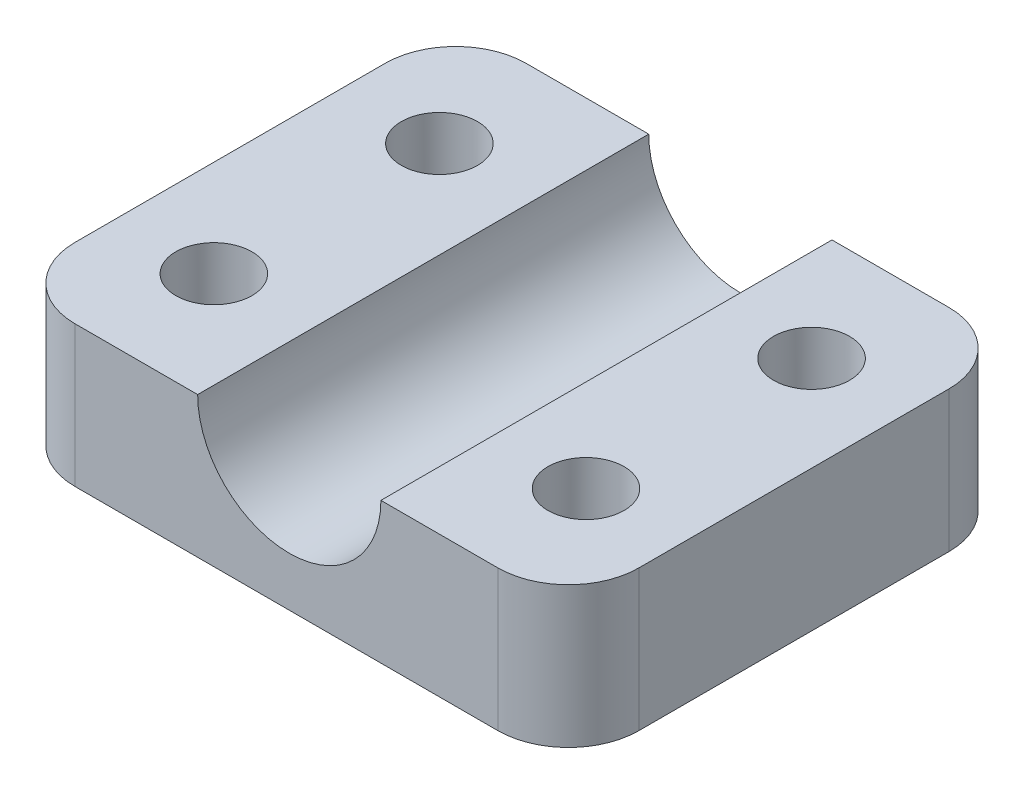
ISO-10303-21;
HEADER;
FILE_DESCRIPTION(('STEP AP214'),'2;1');
FILE_NAME('part.step','',(''),(''),'','','');
FILE_SCHEMA(('AUTOMOTIVE_DESIGN { 1 0 10303 214 1 1 1 1 }'));
ENDSEC;
DATA;
#1=APPLICATION_CONTEXT('core data for automotive mechanical design processes');
#2=APPLICATION_PROTOCOL_DEFINITION('international standard','automotive_design',2000,#1);
#3=PRODUCT_CONTEXT('',#1,'mechanical');
#4=PRODUCT('Part','Part','',(#3));
#5=PRODUCT_RELATED_PRODUCT_CATEGORY('part','',(#4));
#6=PRODUCT_DEFINITION_FORMATION('','',#4);
#7=PRODUCT_DEFINITION_CONTEXT('part definition',#1,'design');
#8=PRODUCT_DEFINITION('design','',#6,#7);
#9=PRODUCT_DEFINITION_SHAPE('','',#8);
#10=(LENGTH_UNIT() NAMED_UNIT(*) SI_UNIT(.MILLI.,.METRE.));
#11=(NAMED_UNIT(*) PLANE_ANGLE_UNIT() SI_UNIT($,.RADIAN.));
#12=(NAMED_UNIT(*) SI_UNIT($,.STERADIAN.) SOLID_ANGLE_UNIT());
#13=UNCERTAINTY_MEASURE_WITH_UNIT(LENGTH_MEASURE(1.E-05),#10,'distance_accuracy_value','');
#14=(GEOMETRIC_REPRESENTATION_CONTEXT(3) GLOBAL_UNCERTAINTY_ASSIGNED_CONTEXT((#13)) GLOBAL_UNIT_ASSIGNED_CONTEXT((#10,
#11,#12)) REPRESENTATION_CONTEXT('',''));
#15=CARTESIAN_POINT('',(0.,0.,0.));
#16=DIRECTION('',(0.,0.,1.));
#17=DIRECTION('',(1.,0.,0.));
#18=AXIS2_PLACEMENT_3D('',#15,#16,#17);
#19=CARTESIAN_POINT('',(0.,12.7,0.));
#20=DIRECTION('',(0.,-1.,0.));
#21=DIRECTION('',(0.,0.,-1.));
#22=AXIS2_PLACEMENT_3D('',#19,#20,#21);
#23=PLANE('',#22);
#24=CARTESIAN_POINT('',(42.2274999999999,12.7,-30.48));
#25=DIRECTION('',(0.,-1.,0.));
#26=DIRECTION('',(0.,0.,-1.));
#27=AXIS2_PLACEMENT_3D('',#24,#25,#26);
#28=CIRCLE('',#27,3.429);
#29=CARTESIAN_POINT('',(42.2274999999999,12.7,-33.909));
#30=VERTEX_POINT('',#29);
#31=EDGE_CURVE('E139',#30,#30,#28,.T.);
#32=ORIENTED_EDGE('',*,*,#31,.T.);
#33=EDGE_LOOP('',(#32));
#34=FACE_BOUND('',#33,.T.);
#35=CARTESIAN_POINT('',(42.2275,12.7,-10.16));
#36=DIRECTION('',(0.,-1.,0.));
#37=DIRECTION('',(0.,0.,-1.));
#38=AXIS2_PLACEMENT_3D('',#35,#36,#37);
#39=CIRCLE('',#38,3.429);
#40=CARTESIAN_POINT('',(42.2275,12.7,-13.589));
#41=VERTEX_POINT('',#40);
#42=EDGE_CURVE('E248',#41,#41,#39,.T.);
#43=ORIENTED_EDGE('',*,*,#42,.T.);
#44=EDGE_LOOP('',(#43));
#45=FACE_BOUND('',#44,.T.);
#46=DIRECTION('',(1.,0.,0.));
#47=VECTOR('',#46,1.);
#48=CARTESIAN_POINT('',(0.,12.7,0.));
#49=LINE('',#48,#47);
#50=CARTESIAN_POINT('',(33.909,12.7,0.));
#51=VERTEX_POINT('',#50);
#52=CARTESIAN_POINT('',(44.45,12.7,0.));
#53=VERTEX_POINT('',#52);
#54=EDGE_CURVE('E146',#51,#53,#49,.T.);
#55=ORIENTED_EDGE('',*,*,#54,.T.);
#56=CARTESIAN_POINT('',(44.45,12.7,-6.35));
#57=DIRECTION('',(0.,-1.,0.));
#58=DIRECTION('',(0.,0.,-1.));
#59=AXIS2_PLACEMENT_3D('',#56,#57,#58);
#60=CIRCLE('',#59,6.35);
#61=CARTESIAN_POINT('',(50.8,12.7,-6.35));
#62=VERTEX_POINT('',#61);
#63=EDGE_CURVE('E180',#53,#62,#60,.F.);
#64=ORIENTED_EDGE('',*,*,#63,.T.);
#65=DIRECTION('',(0.,0.,-1.));
#66=VECTOR('',#65,1.);
#67=CARTESIAN_POINT('',(50.8,12.7,0.));
#68=LINE('',#67,#66);
#69=CARTESIAN_POINT('',(50.8,12.7,-34.29));
#70=VERTEX_POINT('',#69);
#71=EDGE_CURVE('E150',#62,#70,#68,.T.);
#72=ORIENTED_EDGE('',*,*,#71,.T.);
#73=CARTESIAN_POINT('',(44.45,12.7,-34.29));
#74=DIRECTION('',(0.,-1.,0.));
#75=DIRECTION('',(0.,0.,-1.));
#76=AXIS2_PLACEMENT_3D('',#73,#74,#75);
#77=CIRCLE('',#76,6.35);
#78=CARTESIAN_POINT('',(44.45,12.7,-40.64));
#79=VERTEX_POINT('',#78);
#80=EDGE_CURVE('E119',#70,#79,#77,.F.);
#81=ORIENTED_EDGE('',*,*,#80,.T.);
#82=DIRECTION('',(-1.,0.,0.));
#83=VECTOR('',#82,1.);
#84=CARTESIAN_POINT('',(0.,12.7,-40.64));
#85=LINE('',#84,#83);
#86=CARTESIAN_POINT('',(33.909,12.7,-40.64));
#87=VERTEX_POINT('',#86);
#88=EDGE_CURVE('E112',#79,#87,#85,.T.);
#89=ORIENTED_EDGE('',*,*,#88,.T.);
#90=DIRECTION('',(0.,0.,1.));
#91=VECTOR('',#90,1.);
#92=CARTESIAN_POINT('',(33.909,12.7,-40.64));
#93=LINE('',#92,#91);
#94=EDGE_CURVE('E115',#87,#51,#93,.T.);
#95=ORIENTED_EDGE('',*,*,#94,.T.);
#96=EDGE_LOOP('',(#55,#64,#72,#81,#89,#95));
#97=FACE_BOUND('',#96,.T.);
#98=ADVANCED_FACE('F33',(#34,#45,#97),#23,.F.);
#99=CARTESIAN_POINT('',(0.,12.7,0.));
#100=DIRECTION('',(1.,0.,0.));
#101=DIRECTION('',(0.,0.,-1.));
#102=AXIS2_PLACEMENT_3D('',#99,#100,#101);
#103=PLANE('',#102);
#104=DIRECTION('',(0.,0.,1.));
#105=VECTOR('',#104,1.);
#106=CARTESIAN_POINT('',(0.,0.,0.));
#107=LINE('',#106,#105);
#108=CARTESIAN_POINT('',(0.,0.,-34.29));
#109=VERTEX_POINT('',#108);
#110=CARTESIAN_POINT('',(0.,0.,-6.35));
#111=VERTEX_POINT('',#110);
#112=EDGE_CURVE('E152',#109,#111,#107,.T.);
#113=ORIENTED_EDGE('',*,*,#112,.T.);
#114=DIRECTION('',(0.,-1.,0.));
#115=VECTOR('',#114,1.);
#116=CARTESIAN_POINT('',(0.,12.7,-6.35));
#117=LINE('',#116,#115);
#118=CARTESIAN_POINT('',(0.,12.7,-6.35));
#119=VERTEX_POINT('',#118);
#120=EDGE_CURVE('E54',#111,#119,#117,.F.);
#121=ORIENTED_EDGE('',*,*,#120,.T.);
#122=DIRECTION('',(0.,0.,1.));
#123=VECTOR('',#122,1.);
#124=CARTESIAN_POINT('',(0.,12.7,0.));
#125=LINE('',#124,#123);
#126=CARTESIAN_POINT('',(0.,12.7,-34.29));
#127=VERTEX_POINT('',#126);
#128=EDGE_CURVE('E144',#127,#119,#125,.T.);
#129=ORIENTED_EDGE('',*,*,#128,.F.);
#130=DIRECTION('',(0.,-1.,0.));
#131=VECTOR('',#130,1.);
#132=CARTESIAN_POINT('',(0.,12.7,-34.29));
#133=LINE('',#132,#131);
#134=EDGE_CURVE('E182',#127,#109,#133,.T.);
#135=ORIENTED_EDGE('',*,*,#134,.T.);
#136=EDGE_LOOP('',(#113,#121,#129,#135));
#137=FACE_BOUND('',#136,.T.);
#138=ADVANCED_FACE('F199',(#137),#103,.F.);
#139=CARTESIAN_POINT('',(0.,12.7,0.));
#140=DIRECTION('',(0.,0.,-1.));
#141=DIRECTION('',(-1.,0.,0.));
#142=AXIS2_PLACEMENT_3D('',#139,#140,#141);
#143=PLANE('',#142);
#144=DIRECTION('',(1.,0.,0.));
#145=VECTOR('',#144,1.);
#146=CARTESIAN_POINT('',(0.,0.,0.));
#147=LINE('',#146,#145);
#148=CARTESIAN_POINT('',(6.35,0.,0.));
#149=VERTEX_POINT('',#148);
#150=CARTESIAN_POINT('',(44.45,0.,0.));
#151=VERTEX_POINT('',#150);
#152=EDGE_CURVE('E154',#149,#151,#147,.T.);
#153=ORIENTED_EDGE('',*,*,#152,.T.);
#154=DIRECTION('',(0.,-1.,0.));
#155=VECTOR('',#154,1.);
#156=CARTESIAN_POINT('',(44.45,12.7,0.));
#157=LINE('',#156,#155);
#158=EDGE_CURVE('E177',#151,#53,#157,.F.);
#159=ORIENTED_EDGE('',*,*,#158,.T.);
#160=ORIENTED_EDGE('',*,*,#54,.F.);
#161=CARTESIAN_POINT('',(25.654,12.7,0.));
#162=DIRECTION('',(0.,0.,1.));
#163=DIRECTION('',(1.,0.,0.));
#164=AXIS2_PLACEMENT_3D('',#161,#162,#163);
#165=CIRCLE('',#164,8.255);
#166=CARTESIAN_POINT('',(17.399,12.7,0.));
#167=VERTEX_POINT('',#166);
#168=EDGE_CURVE('E132',#167,#51,#165,.T.);
#169=ORIENTED_EDGE('',*,*,#168,.F.);
#170=CARTESIAN_POINT('',(6.35,12.7,0.));
#171=VERTEX_POINT('',#170);
#172=EDGE_CURVE('E148',#171,#167,#49,.T.);
#173=ORIENTED_EDGE('',*,*,#172,.F.);
#174=DIRECTION('',(0.,-1.,0.));
#175=VECTOR('',#174,1.);
#176=CARTESIAN_POINT('',(6.35,12.7,0.));
#177=LINE('',#176,#175);
#178=EDGE_CURVE('E174',#171,#149,#177,.T.);
#179=ORIENTED_EDGE('',*,*,#178,.T.);
#180=EDGE_LOOP('',(#153,#159,#160,#169,#173,#179));
#181=FACE_BOUND('',#180,.T.);
#182=ADVANCED_FACE('F209',(#181),#143,.F.);
#183=CARTESIAN_POINT('',(50.8,12.7,0.));
#184=DIRECTION('',(-1.,0.,0.));
#185=DIRECTION('',(0.,0.,1.));
#186=AXIS2_PLACEMENT_3D('',#183,#184,#185);
#187=PLANE('',#186);
#188=ORIENTED_EDGE('',*,*,#71,.F.);
#189=DIRECTION('',(0.,-1.,0.));
#190=VECTOR('',#189,1.);
#191=CARTESIAN_POINT('',(50.8,12.7,-6.35));
#192=LINE('',#191,#190);
#193=CARTESIAN_POINT('',(50.8,0.,-6.35));
#194=VERTEX_POINT('',#193);
#195=EDGE_CURVE('E163',#62,#194,#192,.T.);
#196=ORIENTED_EDGE('',*,*,#195,.T.);
#197=DIRECTION('',(0.,0.,-1.));
#198=VECTOR('',#197,1.);
#199=CARTESIAN_POINT('',(50.8,0.,0.));
#200=LINE('',#199,#198);
#201=CARTESIAN_POINT('',(50.8,0.,-34.29));
#202=VERTEX_POINT('',#201);
#203=EDGE_CURVE('E157',#194,#202,#200,.T.);
#204=ORIENTED_EDGE('',*,*,#203,.T.);
#205=DIRECTION('',(0.,-1.,0.));
#206=VECTOR('',#205,1.);
#207=CARTESIAN_POINT('',(50.8,12.7,-34.29));
#208=LINE('',#207,#206);
#209=EDGE_CURVE('E123',#202,#70,#208,.F.);
#210=ORIENTED_EDGE('',*,*,#209,.T.);
#211=EDGE_LOOP('',(#188,#196,#204,#210));
#212=FACE_BOUND('',#211,.T.);
#213=ADVANCED_FACE('F217',(#212),#187,.F.);
#214=CARTESIAN_POINT('',(0.,12.7,-40.64));
#215=DIRECTION('',(0.,0.,1.));
#216=DIRECTION('',(1.,0.,0.));
#217=AXIS2_PLACEMENT_3D('',#214,#215,#216);
#218=PLANE('',#217);
#219=DIRECTION('',(-1.,0.,0.));
#220=VECTOR('',#219,1.);
#221=CARTESIAN_POINT('',(0.,0.,-40.64));
#222=LINE('',#221,#220);
#223=CARTESIAN_POINT('',(44.45,0.,-40.64));
#224=VERTEX_POINT('',#223);
#225=CARTESIAN_POINT('',(6.35,0.,-40.64));
#226=VERTEX_POINT('',#225);
#227=EDGE_CURVE('E147',#224,#226,#222,.T.);
#228=ORIENTED_EDGE('',*,*,#227,.T.);
#229=DIRECTION('',(0.,-1.,0.));
#230=VECTOR('',#229,1.);
#231=CARTESIAN_POINT('',(6.35,12.7,-40.64));
#232=LINE('',#231,#230);
#233=CARTESIAN_POINT('',(6.35,12.7,-40.64));
#234=VERTEX_POINT('',#233);
#235=EDGE_CURVE('E11',#226,#234,#232,.F.);
#236=ORIENTED_EDGE('',*,*,#235,.T.);
#237=CARTESIAN_POINT('',(17.399,12.7,-40.64));
#238=VERTEX_POINT('',#237);
#239=EDGE_CURVE('E124',#238,#234,#85,.T.);
#240=ORIENTED_EDGE('',*,*,#239,.F.);
#241=CARTESIAN_POINT('',(25.654,12.7,-40.64));
#242=DIRECTION('',(0.,0.,1.));
#243=DIRECTION('',(1.,0.,0.));
#244=AXIS2_PLACEMENT_3D('',#241,#242,#243);
#245=CIRCLE('',#244,8.255);
#246=EDGE_CURVE('E129',#238,#87,#245,.T.);
#247=ORIENTED_EDGE('',*,*,#246,.T.);
#248=ORIENTED_EDGE('',*,*,#88,.F.);
#249=DIRECTION('',(0.,-1.,0.));
#250=VECTOR('',#249,1.);
#251=CARTESIAN_POINT('',(44.45,12.7,-40.64));
#252=LINE('',#251,#250);
#253=EDGE_CURVE('E41',#79,#224,#252,.T.);
#254=ORIENTED_EDGE('',*,*,#253,.T.);
#255=EDGE_LOOP('',(#228,#236,#240,#247,#248,#254));
#256=FACE_BOUND('',#255,.T.);
#257=ADVANCED_FACE('F135',(#256),#218,.F.);
#258=CARTESIAN_POINT('',(8.69949999999993,12.7,-30.48));
#259=DIRECTION('',(0.,-1.,0.));
#260=DIRECTION('',(0.,0.,-1.));
#261=AXIS2_PLACEMENT_3D('',#258,#259,#260);
#262=CIRCLE('',#261,3.429);
#263=CARTESIAN_POINT('',(8.69949999999993,12.7,-33.909));
#264=VERTEX_POINT('',#263);
#265=EDGE_CURVE('E136',#264,#264,#262,.T.);
#266=ORIENTED_EDGE('',*,*,#265,.T.);
#267=EDGE_LOOP('',(#266));
#268=FACE_BOUND('',#267,.T.);
#269=CARTESIAN_POINT('',(8.6995,12.7,-10.16));
#270=DIRECTION('',(0.,-1.,0.));
#271=DIRECTION('',(0.,0.,-1.));
#272=AXIS2_PLACEMENT_3D('',#269,#270,#271);
#273=CIRCLE('',#272,3.429);
#274=CARTESIAN_POINT('',(8.6995,12.7,-13.589));
#275=VERTEX_POINT('',#274);
#276=EDGE_CURVE('E246',#275,#275,#273,.T.);
#277=ORIENTED_EDGE('',*,*,#276,.T.);
#278=EDGE_LOOP('',(#277));
#279=FACE_BOUND('',#278,.T.);
#280=ORIENTED_EDGE('',*,*,#128,.T.);
#281=CARTESIAN_POINT('',(6.35,12.7,-6.35));
#282=DIRECTION('',(0.,-1.,0.));
#283=DIRECTION('',(0.,0.,-1.));
#284=AXIS2_PLACEMENT_3D('',#281,#282,#283);
#285=CIRCLE('',#284,6.35);
#286=EDGE_CURVE('E188',#119,#171,#285,.F.);
#287=ORIENTED_EDGE('',*,*,#286,.T.);
#288=ORIENTED_EDGE('',*,*,#172,.T.);
#289=DIRECTION('',(0.,0.,1.));
#290=VECTOR('',#289,1.);
#291=CARTESIAN_POINT('',(17.399,12.7,-40.64));
#292=LINE('',#291,#290);
#293=EDGE_CURVE('E133',#238,#167,#292,.T.);
#294=ORIENTED_EDGE('',*,*,#293,.F.);
#295=ORIENTED_EDGE('',*,*,#239,.T.);
#296=CARTESIAN_POINT('',(6.35,12.7,-34.29));
#297=DIRECTION('',(0.,-1.,0.));
#298=DIRECTION('',(0.,0.,-1.));
#299=AXIS2_PLACEMENT_3D('',#296,#297,#298);
#300=CIRCLE('',#299,6.35);
#301=EDGE_CURVE('E186',#234,#127,#300,.F.);
#302=ORIENTED_EDGE('',*,*,#301,.T.);
#303=EDGE_LOOP('',(#280,#287,#288,#294,#295,#302));
#304=FACE_BOUND('',#303,.T.);
#305=ADVANCED_FACE('F202',(#268,#279,#304),#23,.F.);
#306=CARTESIAN_POINT('',(0.,0.,0.));
#307=DIRECTION('',(0.,-1.,0.));
#308=DIRECTION('',(0.,0.,-1.));
#309=AXIS2_PLACEMENT_3D('',#306,#307,#308);
#310=PLANE('',#309);
#311=CARTESIAN_POINT('',(8.69949999999993,0.,-30.48));
#312=DIRECTION('',(0.,1.,0.));
#313=DIRECTION('',(0.,0.,1.));
#314=AXIS2_PLACEMENT_3D('',#311,#312,#313);
#315=CIRCLE('',#314,3.429);
#316=CARTESIAN_POINT('',(8.69949999999993,0.,-27.051));
#317=VERTEX_POINT('',#316);
#318=EDGE_CURVE('E380',#317,#317,#315,.T.);
#319=ORIENTED_EDGE('',*,*,#318,.T.);
#320=EDGE_LOOP('',(#319));
#321=FACE_BOUND('',#320,.T.);
#322=CARTESIAN_POINT('',(42.2274999999999,0.,-30.48));
#323=DIRECTION('',(0.,1.,0.));
#324=DIRECTION('',(0.,0.,1.));
#325=AXIS2_PLACEMENT_3D('',#322,#323,#324);
#326=CIRCLE('',#325,3.429);
#327=CARTESIAN_POINT('',(42.2274999999999,0.,-27.051));
#328=VERTEX_POINT('',#327);
#329=EDGE_CURVE('E378',#328,#328,#326,.T.);
#330=ORIENTED_EDGE('',*,*,#329,.T.);
#331=EDGE_LOOP('',(#330));
#332=FACE_BOUND('',#331,.T.);
#333=CARTESIAN_POINT('',(42.2275,0.,-10.16));
#334=DIRECTION('',(0.,1.,0.));
#335=DIRECTION('',(0.,0.,1.));
#336=AXIS2_PLACEMENT_3D('',#333,#334,#335);
#337=CIRCLE('',#336,3.429);
#338=CARTESIAN_POINT('',(42.2275,0.,-6.731));
#339=VERTEX_POINT('',#338);
#340=EDGE_CURVE('E254',#339,#339,#337,.T.);
#341=ORIENTED_EDGE('',*,*,#340,.T.);
#342=EDGE_LOOP('',(#341));
#343=FACE_BOUND('',#342,.T.);
#344=CARTESIAN_POINT('',(8.6995,0.,-10.16));
#345=DIRECTION('',(0.,1.,0.));
#346=DIRECTION('',(0.,0.,1.));
#347=AXIS2_PLACEMENT_3D('',#344,#345,#346);
#348=CIRCLE('',#347,3.429);
#349=CARTESIAN_POINT('',(8.6995,0.,-6.731));
#350=VERTEX_POINT('',#349);
#351=EDGE_CURVE('E249',#350,#350,#348,.T.);
#352=ORIENTED_EDGE('',*,*,#351,.T.);
#353=EDGE_LOOP('',(#352));
#354=FACE_BOUND('',#353,.T.);
#355=ORIENTED_EDGE('',*,*,#203,.F.);
#356=CARTESIAN_POINT('',(44.45,0.,-6.35));
#357=DIRECTION('',(0.,-1.,0.));
#358=DIRECTION('',(0.,0.,-1.));
#359=AXIS2_PLACEMENT_3D('',#356,#357,#358);
#360=CIRCLE('',#359,6.35);
#361=EDGE_CURVE('E172',#194,#151,#360,.T.);
#362=ORIENTED_EDGE('',*,*,#361,.T.);
#363=ORIENTED_EDGE('',*,*,#152,.F.);
#364=CARTESIAN_POINT('',(6.35,0.,-6.35));
#365=DIRECTION('',(0.,-1.,0.));
#366=DIRECTION('',(0.,0.,-1.));
#367=AXIS2_PLACEMENT_3D('',#364,#365,#366);
#368=CIRCLE('',#367,6.35);
#369=EDGE_CURVE('E170',#149,#111,#368,.T.);
#370=ORIENTED_EDGE('',*,*,#369,.T.);
#371=ORIENTED_EDGE('',*,*,#112,.F.);
#372=CARTESIAN_POINT('',(6.35,0.,-34.29));
#373=DIRECTION('',(0.,-1.,0.));
#374=DIRECTION('',(0.,0.,-1.));
#375=AXIS2_PLACEMENT_3D('',#372,#373,#374);
#376=CIRCLE('',#375,6.35);
#377=EDGE_CURVE('E168',#109,#226,#376,.T.);
#378=ORIENTED_EDGE('',*,*,#377,.T.);
#379=ORIENTED_EDGE('',*,*,#227,.F.);
#380=CARTESIAN_POINT('',(44.45,0.,-34.29));
#381=DIRECTION('',(0.,-1.,0.));
#382=DIRECTION('',(0.,0.,-1.));
#383=AXIS2_PLACEMENT_3D('',#380,#381,#382);
#384=CIRCLE('',#383,6.35);
#385=EDGE_CURVE('E166',#224,#202,#384,.T.);
#386=ORIENTED_EDGE('',*,*,#385,.T.);
#387=EDGE_LOOP('',(#355,#362,#363,#370,#371,#378,#379,#386));
#388=FACE_BOUND('',#387,.T.);
#389=ADVANCED_FACE('F193',(#321,#332,#343,#354,#388),#310,.T.);
#390=CARTESIAN_POINT('',(25.654,12.7,-40.64));
#391=DIRECTION('',(0.,0.,1.));
#392=DIRECTION('',(1.,0.,0.));
#393=AXIS2_PLACEMENT_3D('',#390,#391,#392);
#394=CYLINDRICAL_SURFACE('',#393,8.255);
#395=ORIENTED_EDGE('',*,*,#94,.F.);
#396=ORIENTED_EDGE('',*,*,#246,.F.);
#397=ORIENTED_EDGE('',*,*,#293,.T.);
#398=ORIENTED_EDGE('',*,*,#168,.T.);
#399=EDGE_LOOP('',(#395,#396,#397,#398));
#400=FACE_BOUND('',#399,.T.);
#401=ADVANCED_FACE('F127',(#400),#394,.F.);
#402=CARTESIAN_POINT('',(8.6995,0.,-10.16));
#403=DIRECTION('',(0.,1.,0.));
#404=DIRECTION('',(0.,0.,1.));
#405=AXIS2_PLACEMENT_3D('',#402,#403,#404);
#406=CYLINDRICAL_SURFACE('',#405,3.429);
#407=ORIENTED_EDGE('',*,*,#351,.F.);
#408=EDGE_LOOP('',(#407));
#409=FACE_BOUND('',#408,.T.);
#410=ORIENTED_EDGE('',*,*,#276,.F.);
#411=EDGE_LOOP('',(#410));
#412=FACE_BOUND('',#411,.T.);
#413=ADVANCED_FACE('F271',(#409,#412),#406,.F.);
#414=CARTESIAN_POINT('',(42.2275,0.,-10.16));
#415=DIRECTION('',(0.,1.,0.));
#416=DIRECTION('',(0.,0.,1.));
#417=AXIS2_PLACEMENT_3D('',#414,#415,#416);
#418=CYLINDRICAL_SURFACE('',#417,3.429);
#419=ORIENTED_EDGE('',*,*,#340,.F.);
#420=EDGE_LOOP('',(#419));
#421=FACE_BOUND('',#420,.T.);
#422=ORIENTED_EDGE('',*,*,#42,.F.);
#423=EDGE_LOOP('',(#422));
#424=FACE_BOUND('',#423,.T.);
#425=ADVANCED_FACE('F262',(#421,#424),#418,.F.);
#426=CARTESIAN_POINT('',(42.2274999999999,0.,-30.48));
#427=DIRECTION('',(0.,1.,0.));
#428=DIRECTION('',(0.,0.,1.));
#429=AXIS2_PLACEMENT_3D('',#426,#427,#428);
#430=CYLINDRICAL_SURFACE('',#429,3.429);
#431=ORIENTED_EDGE('',*,*,#329,.F.);
#432=EDGE_LOOP('',(#431));
#433=FACE_BOUND('',#432,.T.);
#434=ORIENTED_EDGE('',*,*,#31,.F.);
#435=EDGE_LOOP('',(#434));
#436=FACE_BOUND('',#435,.T.);
#437=ADVANCED_FACE('F259',(#433,#436),#430,.F.);
#438=CARTESIAN_POINT('',(8.69949999999993,0.,-30.48));
#439=DIRECTION('',(0.,1.,0.));
#440=DIRECTION('',(0.,0.,1.));
#441=AXIS2_PLACEMENT_3D('',#438,#439,#440);
#442=CYLINDRICAL_SURFACE('',#441,3.429);
#443=ORIENTED_EDGE('',*,*,#318,.F.);
#444=EDGE_LOOP('',(#443));
#445=FACE_BOUND('',#444,.T.);
#446=ORIENTED_EDGE('',*,*,#265,.F.);
#447=EDGE_LOOP('',(#446));
#448=FACE_BOUND('',#447,.T.);
#449=ADVANCED_FACE('F261',(#445,#448),#442,.F.);
#450=CARTESIAN_POINT('',(44.45,12.7,-6.35));
#451=DIRECTION('',(0.,-1.,0.));
#452=DIRECTION('',(0.,0.,-1.));
#453=AXIS2_PLACEMENT_3D('',#450,#451,#452);
#454=CYLINDRICAL_SURFACE('',#453,6.35);
#455=ORIENTED_EDGE('',*,*,#63,.F.);
#456=ORIENTED_EDGE('',*,*,#158,.F.);
#457=ORIENTED_EDGE('',*,*,#361,.F.);
#458=ORIENTED_EDGE('',*,*,#195,.F.);
#459=EDGE_LOOP('',(#455,#456,#457,#458));
#460=FACE_BOUND('',#459,.T.);
#461=ADVANCED_FACE('F214',(#460),#454,.T.);
#462=CARTESIAN_POINT('',(6.35,12.7,-6.35));
#463=DIRECTION('',(0.,-1.,0.));
#464=DIRECTION('',(0.,0.,-1.));
#465=AXIS2_PLACEMENT_3D('',#462,#463,#464);
#466=CYLINDRICAL_SURFACE('',#465,6.35);
#467=ORIENTED_EDGE('',*,*,#286,.F.);
#468=ORIENTED_EDGE('',*,*,#120,.F.);
#469=ORIENTED_EDGE('',*,*,#369,.F.);
#470=ORIENTED_EDGE('',*,*,#178,.F.);
#471=EDGE_LOOP('',(#467,#468,#469,#470));
#472=FACE_BOUND('',#471,.T.);
#473=ADVANCED_FACE('F206',(#472),#466,.T.);
#474=CARTESIAN_POINT('',(6.35,12.7,-34.29));
#475=DIRECTION('',(0.,-1.,0.));
#476=DIRECTION('',(0.,0.,-1.));
#477=AXIS2_PLACEMENT_3D('',#474,#475,#476);
#478=CYLINDRICAL_SURFACE('',#477,6.35);
#479=ORIENTED_EDGE('',*,*,#301,.F.);
#480=ORIENTED_EDGE('',*,*,#235,.F.);
#481=ORIENTED_EDGE('',*,*,#377,.F.);
#482=ORIENTED_EDGE('',*,*,#134,.F.);
#483=EDGE_LOOP('',(#479,#480,#481,#482));
#484=FACE_BOUND('',#483,.T.);
#485=ADVANCED_FACE('F198',(#484),#478,.T.);
#486=CARTESIAN_POINT('',(44.45,12.7,-34.29));
#487=DIRECTION('',(0.,-1.,0.));
#488=DIRECTION('',(0.,0.,-1.));
#489=AXIS2_PLACEMENT_3D('',#486,#487,#488);
#490=CYLINDRICAL_SURFACE('',#489,6.35);
#491=ORIENTED_EDGE('',*,*,#80,.F.);
#492=ORIENTED_EDGE('',*,*,#209,.F.);
#493=ORIENTED_EDGE('',*,*,#385,.F.);
#494=ORIENTED_EDGE('',*,*,#253,.F.);
#495=EDGE_LOOP('',(#491,#492,#493,#494));
#496=FACE_BOUND('',#495,.T.);
#497=ADVANCED_FACE('F35',(#496),#490,.T.);
#498=CLOSED_SHELL('',(#98,#138,#182,#213,#257,#305,#389,#401,#413,#425,#437,#449,#461,#473,#485,#497));
#499=MANIFOLD_SOLID_BREP('B2',#498);
#500=ADVANCED_BREP_SHAPE_REPRESENTATION('',(#18,#499),#14);
#501=SHAPE_DEFINITION_REPRESENTATION(#9,#500);
ENDSEC;
END-ISO-10303-21;
